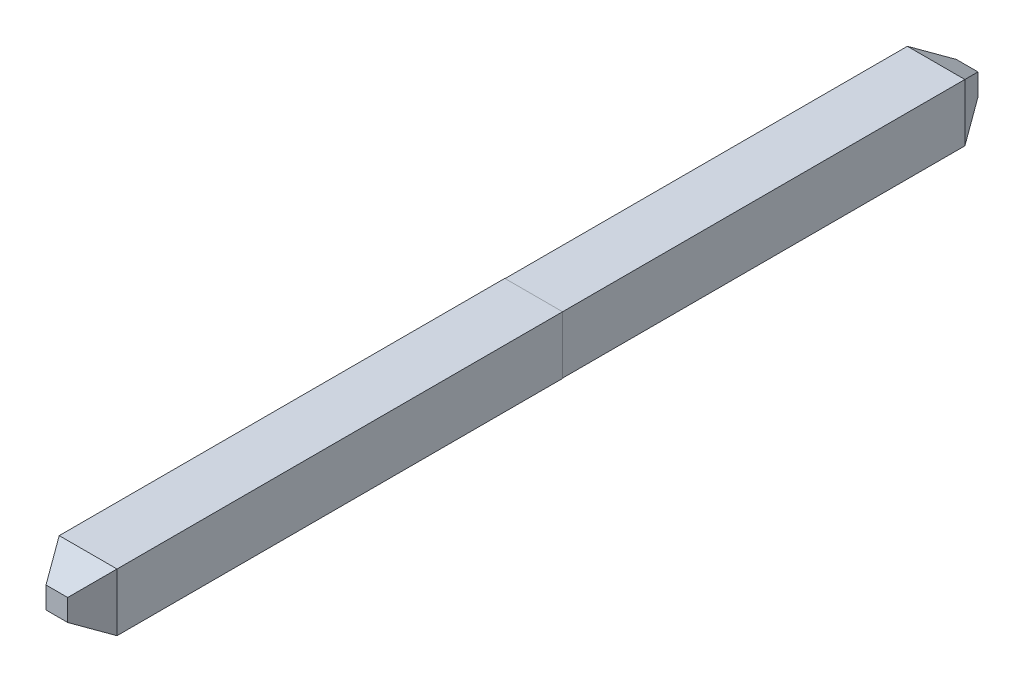
ISO-10303-21;
HEADER;
FILE_DESCRIPTION(('STEP AP214'),'2;1');
FILE_NAME('part.step','',(''),(''),'','','');
FILE_SCHEMA(('AUTOMOTIVE_DESIGN { 1 0 10303 214 1 1 1 1 }'));
ENDSEC;
DATA;
#1=APPLICATION_CONTEXT('core data for automotive mechanical design processes');
#2=APPLICATION_PROTOCOL_DEFINITION('international standard','automotive_design',2000,#1);
#3=PRODUCT_CONTEXT('',#1,'mechanical');
#4=PRODUCT('Part','Part','',(#3));
#5=PRODUCT_RELATED_PRODUCT_CATEGORY('part','',(#4));
#6=PRODUCT_DEFINITION_FORMATION('','',#4);
#7=PRODUCT_DEFINITION_CONTEXT('part definition',#1,'design');
#8=PRODUCT_DEFINITION('design','',#6,#7);
#9=PRODUCT_DEFINITION_SHAPE('','',#8);
#10=(LENGTH_UNIT() NAMED_UNIT(*) SI_UNIT(.MILLI.,.METRE.));
#11=(NAMED_UNIT(*) PLANE_ANGLE_UNIT() SI_UNIT($,.RADIAN.));
#12=(NAMED_UNIT(*) SI_UNIT($,.STERADIAN.) SOLID_ANGLE_UNIT());
#13=UNCERTAINTY_MEASURE_WITH_UNIT(LENGTH_MEASURE(1.E-05),#10,'distance_accuracy_value','');
#14=(GEOMETRIC_REPRESENTATION_CONTEXT(3) GLOBAL_UNCERTAINTY_ASSIGNED_CONTEXT((#13)) GLOBAL_UNIT_ASSIGNED_CONTEXT((#10,
#11,#12)) REPRESENTATION_CONTEXT('',''));
#15=CARTESIAN_POINT('',(0.,0.,0.));
#16=DIRECTION('',(0.,0.,1.));
#17=DIRECTION('',(1.,0.,0.));
#18=AXIS2_PLACEMENT_3D('',#15,#16,#17);
#19=CARTESIAN_POINT('',(-0.2,0.075,-1.64));
#20=DIRECTION('',(0.,-0.866025403784429,0.500000000000017));
#21=DIRECTION('',(0.,-0.500000000000017,-0.866025403784429));
#22=AXIS2_PLACEMENT_3D('',#19,#20,#21);
#23=PLANE('',#22);
#24=DIRECTION('',(-1.,0.,0.));
#25=VECTOR('',#24,1.);
#26=CARTESIAN_POINT('',(0.,0.075,-1.64));
#27=LINE('',#26,#25);
#28=CARTESIAN_POINT('',(-0.075,0.075,-1.64));
#29=VERTEX_POINT('',#28);
#30=CARTESIAN_POINT('',(0.075,0.075,-1.64));
#31=VERTEX_POINT('',#30);
#32=EDGE_CURVE('E20',#29,#31,#27,.F.);
#33=ORIENTED_EDGE('',*,*,#32,.F.);
#34=DIRECTION('',(-0.447213595500116,0.447213595499384,0.774596669241723));
#35=VECTOR('',#34,1.);
#36=CARTESIAN_POINT('',(-0.075,0.075,-1.64));
#37=LINE('',#36,#35);
#38=CARTESIAN_POINT('',(-0.199000000000051,0.199000000000101,-1.42522569986109));
#39=VERTEX_POINT('',#38);
#40=EDGE_CURVE('E134',#29,#39,#37,.T.);
#41=ORIENTED_EDGE('',*,*,#40,.T.);
#42=DIRECTION('',(1.,0.,0.));
#43=VECTOR('',#42,1.);
#44=CARTESIAN_POINT('',(0.199,0.199,-1.425225699861));
#45=LINE('',#44,#43);
#46=CARTESIAN_POINT('',(0.199000000000051,0.199000000000101,-1.42522569986109));
#47=VERTEX_POINT('',#46);
#48=EDGE_CURVE('E161',#39,#47,#45,.T.);
#49=ORIENTED_EDGE('',*,*,#48,.T.);
#50=DIRECTION('',(-0.447213595500116,-0.447213595499384,-0.774596669241723));
#51=VECTOR('',#50,1.);
#52=CARTESIAN_POINT('',(0.199000000000203,0.199,-1.42522569986112));
#53=LINE('',#52,#51);
#54=EDGE_CURVE('E129',#47,#31,#53,.T.);
#55=ORIENTED_EDGE('',*,*,#54,.T.);
#56=EDGE_LOOP('',(#33,#41,#49,#55));
#57=FACE_BOUND('',#56,.T.);
#58=ADVANCED_FACE('F17',(#57),#23,.F.);
#59=CARTESIAN_POINT('',(0.,0.,-1.64));
#60=DIRECTION('',(0.,0.,-1.));
#61=DIRECTION('',(-1.,0.,0.));
#62=AXIS2_PLACEMENT_3D('',#59,#60,#61);
#63=PLANE('',#62);
#64=DIRECTION('',(0.,1.,0.));
#65=VECTOR('',#64,1.);
#66=CARTESIAN_POINT('',(0.075,0.2,-1.64));
#67=LINE('',#66,#65);
#68=CARTESIAN_POINT('',(0.075,-0.075,-1.64));
#69=VERTEX_POINT('',#68);
#70=EDGE_CURVE('E156',#31,#69,#67,.F.);
#71=ORIENTED_EDGE('',*,*,#70,.T.);
#72=DIRECTION('',(1.,0.,0.));
#73=VECTOR('',#72,1.);
#74=CARTESIAN_POINT('',(0.2,-0.075,-1.64));
#75=LINE('',#74,#73);
#76=CARTESIAN_POINT('',(-0.075,-0.075,-1.64));
#77=VERTEX_POINT('',#76);
#78=EDGE_CURVE('E143',#69,#77,#75,.F.);
#79=ORIENTED_EDGE('',*,*,#78,.T.);
#80=DIRECTION('',(0.,1.,0.));
#81=VECTOR('',#80,1.);
#82=CARTESIAN_POINT('',(-0.075,-0.2,-1.64));
#83=LINE('',#82,#81);
#84=EDGE_CURVE('E139',#77,#29,#83,.T.);
#85=ORIENTED_EDGE('',*,*,#84,.T.);
#86=ORIENTED_EDGE('',*,*,#32,.T.);
#87=EDGE_LOOP('',(#71,#79,#85,#86));
#88=FACE_BOUND('',#87,.T.);
#89=ADVANCED_FACE('F141',(#88),#63,.T.);
#90=CARTESIAN_POINT('',(-0.075,-0.2,-1.64));
#91=DIRECTION('',(0.866025403784429,0.,0.500000000000017));
#92=DIRECTION('',(0.500000000000017,0.,-0.866025403784429));
#93=AXIS2_PLACEMENT_3D('',#90,#91,#92);
#94=PLANE('',#93);
#95=ORIENTED_EDGE('',*,*,#84,.F.);
#96=DIRECTION('',(-0.447213595499384,-0.447213595500116,0.774596669241723));
#97=VECTOR('',#96,1.);
#98=CARTESIAN_POINT('',(-0.075,-0.075,-1.64));
#99=LINE('',#98,#97);
#100=CARTESIAN_POINT('',(-0.199000000000101,-0.199000000000051,-1.42522569986109));
#101=VERTEX_POINT('',#100);
#102=EDGE_CURVE('E172',#77,#101,#99,.T.);
#103=ORIENTED_EDGE('',*,*,#102,.T.);
#104=DIRECTION('',(0.,1.,0.));
#105=VECTOR('',#104,1.);
#106=CARTESIAN_POINT('',(-0.199,0.199,-1.425225699861));
#107=LINE('',#106,#105);
#108=EDGE_CURVE('E149',#101,#39,#107,.T.);
#109=ORIENTED_EDGE('',*,*,#108,.T.);
#110=ORIENTED_EDGE('',*,*,#40,.F.);
#111=EDGE_LOOP('',(#95,#103,#109,#110));
#112=FACE_BOUND('',#111,.T.);
#113=ADVANCED_FACE('F147',(#112),#94,.F.);
#114=CARTESIAN_POINT('',(0.075,0.2,-1.64));
#115=DIRECTION('',(-0.866025403784429,0.,0.500000000000017));
#116=DIRECTION('',(0.500000000000017,0.,0.866025403784429));
#117=AXIS2_PLACEMENT_3D('',#114,#115,#116);
#118=PLANE('',#117);
#119=ORIENTED_EDGE('',*,*,#70,.F.);
#120=ORIENTED_EDGE('',*,*,#54,.F.);
#121=DIRECTION('',(0.,1.,0.));
#122=VECTOR('',#121,1.);
#123=CARTESIAN_POINT('',(0.199,-0.199,-1.425225699861));
#124=LINE('',#123,#122);
#125=CARTESIAN_POINT('',(0.199000000000101,-0.199000000000051,-1.42522569986109));
#126=VERTEX_POINT('',#125);
#127=EDGE_CURVE('E184',#47,#126,#124,.F.);
#128=ORIENTED_EDGE('',*,*,#127,.T.);
#129=DIRECTION('',(-0.447213595499384,0.447213595500116,-0.774596669241723));
#130=VECTOR('',#129,1.);
#131=CARTESIAN_POINT('',(0.199,-0.199000000000203,-1.42522569986112));
#132=LINE('',#131,#130);
#133=EDGE_CURVE('E166',#126,#69,#132,.T.);
#134=ORIENTED_EDGE('',*,*,#133,.T.);
#135=EDGE_LOOP('',(#119,#120,#128,#134));
#136=FACE_BOUND('',#135,.T.);
#137=ADVANCED_FACE('F350',(#136),#118,.F.);
#138=CARTESIAN_POINT('',(0.199,0.199,-1.64));
#139=DIRECTION('',(0.,-1.,0.));
#140=DIRECTION('',(0.,0.,-1.));
#141=AXIS2_PLACEMENT_3D('',#138,#139,#140);
#142=PLANE('',#141);
#143=DIRECTION('',(1.,0.,0.));
#144=VECTOR('',#143,1.);
#145=CARTESIAN_POINT('',(0.199,0.199,1.36));
#146=LINE('',#145,#144);
#147=CARTESIAN_POINT('',(0.199,0.199,1.36));
#148=VERTEX_POINT('',#147);
#149=CARTESIAN_POINT('',(-0.199,0.199,1.36));
#150=VERTEX_POINT('',#149);
#151=EDGE_CURVE('E163',#148,#150,#146,.F.);
#152=ORIENTED_EDGE('',*,*,#151,.F.);
#153=DIRECTION('',(0.,0.,1.));
#154=VECTOR('',#153,1.);
#155=CARTESIAN_POINT('',(0.199,0.199,-1.64));
#156=LINE('',#155,#154);
#157=EDGE_CURVE('E190',#148,#47,#156,.F.);
#158=ORIENTED_EDGE('',*,*,#157,.T.);
#159=ORIENTED_EDGE('',*,*,#48,.F.);
#160=DIRECTION('',(0.,0.,-1.));
#161=VECTOR('',#160,1.);
#162=CARTESIAN_POINT('',(-0.199,0.199,-1.64));
#163=LINE('',#162,#161);
#164=EDGE_CURVE('E177',#39,#150,#163,.F.);
#165=ORIENTED_EDGE('',*,*,#164,.T.);
#166=EDGE_LOOP('',(#152,#158,#159,#165));
#167=FACE_BOUND('',#166,.T.);
#168=ADVANCED_FACE('F347',(#167),#142,.F.);
#169=CARTESIAN_POINT('',(0.075,0.2,4.66));
#170=DIRECTION('',(0.866025403784429,0.,0.500000000000017));
#171=DIRECTION('',(0.500000000000017,0.,-0.866025403784429));
#172=AXIS2_PLACEMENT_3D('',#169,#170,#171);
#173=PLANE('',#172);
#174=DIRECTION('',(0.447213595500094,0.447213595499939,-0.774596669241416));
#175=VECTOR('',#174,1.);
#176=CARTESIAN_POINT('',(0.075,0.075,4.66));
#177=LINE('',#176,#175);
#178=CARTESIAN_POINT('',(0.075,0.075,4.66));
#179=VERTEX_POINT('',#178);
#180=CARTESIAN_POINT('',(0.199999999999978,0.199999999999989,4.44349364905398));
#181=VERTEX_POINT('',#180);
#182=EDGE_CURVE('E204',#179,#181,#177,.T.);
#183=ORIENTED_EDGE('',*,*,#182,.F.);
#184=DIRECTION('',(0.,1.,0.));
#185=VECTOR('',#184,1.);
#186=CARTESIAN_POINT('',(0.075,0.,4.66));
#187=LINE('',#186,#185);
#188=CARTESIAN_POINT('',(0.075,-0.075,4.66));
#189=VERTEX_POINT('',#188);
#190=EDGE_CURVE('E200',#179,#189,#187,.F.);
#191=ORIENTED_EDGE('',*,*,#190,.T.);
#192=DIRECTION('',(-0.447213595500094,0.447213595499939,0.774596669241416));
#193=VECTOR('',#192,1.);
#194=CARTESIAN_POINT('',(0.2,-0.199999999999957,4.44349364905398));
#195=LINE('',#194,#193);
#196=CARTESIAN_POINT('',(0.199999999999978,-0.199999999999995,4.44349364905398));
#197=VERTEX_POINT('',#196);
#198=EDGE_CURVE('E194',#197,#189,#195,.T.);
#199=ORIENTED_EDGE('',*,*,#198,.F.);
#200=DIRECTION('',(0.,1.,0.));
#201=VECTOR('',#200,1.);
#202=CARTESIAN_POINT('',(0.2,0.2,4.443493649054));
#203=LINE('',#202,#201);
#204=EDGE_CURVE('E212',#181,#197,#203,.F.);
#205=ORIENTED_EDGE('',*,*,#204,.F.);
#206=EDGE_LOOP('',(#183,#191,#199,#205));
#207=FACE_BOUND('',#206,.T.);
#208=ADVANCED_FACE('F294',(#207),#173,.T.);
#209=CARTESIAN_POINT('',(0.2,-0.075,-1.64));
#210=DIRECTION('',(0.,0.866025403784429,0.500000000000017));
#211=DIRECTION('',(0.,-0.500000000000017,0.866025403784429));
#212=AXIS2_PLACEMENT_3D('',#209,#210,#211);
#213=PLANE('',#212);
#214=ORIENTED_EDGE('',*,*,#78,.F.);
#215=ORIENTED_EDGE('',*,*,#133,.F.);
#216=DIRECTION('',(1.,0.,0.));
#217=VECTOR('',#216,1.);
#218=CARTESIAN_POINT('',(-0.199,-0.199,-1.425225699861));
#219=LINE('',#218,#217);
#220=EDGE_CURVE('E219',#126,#101,#219,.F.);
#221=ORIENTED_EDGE('',*,*,#220,.T.);
#222=ORIENTED_EDGE('',*,*,#102,.F.);
#223=EDGE_LOOP('',(#214,#215,#221,#222));
#224=FACE_BOUND('',#223,.T.);
#225=ADVANCED_FACE('F340',(#224),#213,.F.);
#226=CARTESIAN_POINT('',(-0.199,0.199,-1.64));
#227=DIRECTION('',(1.,0.,0.));
#228=DIRECTION('',(0.,0.,-1.));
#229=AXIS2_PLACEMENT_3D('',#226,#227,#228);
#230=PLANE('',#229);
#231=DIRECTION('',(0.,1.,0.));
#232=VECTOR('',#231,1.);
#233=CARTESIAN_POINT('',(-0.199,0.199,1.36));
#234=LINE('',#233,#232);
#235=CARTESIAN_POINT('',(-0.199,-0.199,1.36));
#236=VERTEX_POINT('',#235);
#237=EDGE_CURVE('E181',#150,#236,#234,.F.);
#238=ORIENTED_EDGE('',*,*,#237,.F.);
#239=ORIENTED_EDGE('',*,*,#164,.F.);
#240=ORIENTED_EDGE('',*,*,#108,.F.);
#241=DIRECTION('',(0.,0.,1.));
#242=VECTOR('',#241,1.);
#243=CARTESIAN_POINT('',(-0.199,-0.199,-1.64));
#244=LINE('',#243,#242);
#245=EDGE_CURVE('E223',#101,#236,#244,.T.);
#246=ORIENTED_EDGE('',*,*,#245,.T.);
#247=EDGE_LOOP('',(#238,#239,#240,#246));
#248=FACE_BOUND('',#247,.T.);
#249=ADVANCED_FACE('F336',(#248),#230,.F.);
#250=CARTESIAN_POINT('',(0.199,-0.199,-1.64));
#251=DIRECTION('',(-1.,0.,0.));
#252=DIRECTION('',(0.,0.,1.));
#253=AXIS2_PLACEMENT_3D('',#250,#251,#252);
#254=PLANE('',#253);
#255=DIRECTION('',(0.,1.,0.));
#256=VECTOR('',#255,1.);
#257=CARTESIAN_POINT('',(0.199,-0.199,1.36));
#258=LINE('',#257,#256);
#259=CARTESIAN_POINT('',(0.199,-0.199,1.36));
#260=VERTEX_POINT('',#259);
#261=EDGE_CURVE('E187',#260,#148,#258,.T.);
#262=ORIENTED_EDGE('',*,*,#261,.F.);
#263=DIRECTION('',(0.,0.,1.));
#264=VECTOR('',#263,1.);
#265=CARTESIAN_POINT('',(0.199,-0.199,-1.64));
#266=LINE('',#265,#264);
#267=EDGE_CURVE('E227',#260,#126,#266,.F.);
#268=ORIENTED_EDGE('',*,*,#267,.T.);
#269=ORIENTED_EDGE('',*,*,#127,.F.);
#270=ORIENTED_EDGE('',*,*,#157,.F.);
#271=EDGE_LOOP('',(#262,#268,#269,#270));
#272=FACE_BOUND('',#271,.T.);
#273=ADVANCED_FACE('F333',(#272),#254,.F.);
#274=CARTESIAN_POINT('',(0.2,-0.075,4.66));
#275=DIRECTION('',(0.,-0.866025403784429,0.500000000000017));
#276=DIRECTION('',(0.,-0.500000000000017,-0.866025403784429));
#277=AXIS2_PLACEMENT_3D('',#274,#275,#276);
#278=PLANE('',#277);
#279=ORIENTED_EDGE('',*,*,#198,.T.);
#280=DIRECTION('',(-1.,0.,0.));
#281=VECTOR('',#280,1.);
#282=CARTESIAN_POINT('',(0.,-0.075,4.66));
#283=LINE('',#282,#281);
#284=CARTESIAN_POINT('',(-0.075,-0.075,4.66));
#285=VERTEX_POINT('',#284);
#286=EDGE_CURVE('E197',#189,#285,#283,.T.);
#287=ORIENTED_EDGE('',*,*,#286,.T.);
#288=DIRECTION('',(0.447213595499939,0.447213595500094,0.774596669241416));
#289=VECTOR('',#288,1.);
#290=CARTESIAN_POINT('',(-0.199999999999957,-0.2,4.44349364905398));
#291=LINE('',#290,#289);
#292=CARTESIAN_POINT('',(-0.199999999999995,-0.199999999999978,4.44349364905398));
#293=VERTEX_POINT('',#292);
#294=EDGE_CURVE('E243',#293,#285,#291,.T.);
#295=ORIENTED_EDGE('',*,*,#294,.F.);
#296=DIRECTION('',(1.,0.,0.));
#297=VECTOR('',#296,1.);
#298=CARTESIAN_POINT('',(0.2,-0.2,4.443493649054));
#299=LINE('',#298,#297);
#300=EDGE_CURVE('E235',#197,#293,#299,.F.);
#301=ORIENTED_EDGE('',*,*,#300,.F.);
#302=EDGE_LOOP('',(#279,#287,#295,#301));
#303=FACE_BOUND('',#302,.T.);
#304=ADVANCED_FACE('F301',(#303),#278,.T.);
#305=CARTESIAN_POINT('',(0.,0.,4.66));
#306=DIRECTION('',(0.,0.,-1.));
#307=DIRECTION('',(-1.,0.,0.));
#308=AXIS2_PLACEMENT_3D('',#305,#306,#307);
#309=PLANE('',#308);
#310=DIRECTION('',(1.,0.,0.));
#311=VECTOR('',#310,1.);
#312=CARTESIAN_POINT('',(-0.2,0.075,4.66));
#313=LINE('',#312,#311);
#314=CARTESIAN_POINT('',(-0.075,0.075,4.66));
#315=VERTEX_POINT('',#314);
#316=EDGE_CURVE('E208',#315,#179,#313,.T.);
#317=ORIENTED_EDGE('',*,*,#316,.F.);
#318=DIRECTION('',(0.,1.,0.));
#319=VECTOR('',#318,1.);
#320=CARTESIAN_POINT('',(-0.075,-0.2,4.66));
#321=LINE('',#320,#319);
#322=EDGE_CURVE('E247',#285,#315,#321,.T.);
#323=ORIENTED_EDGE('',*,*,#322,.F.);
#324=ORIENTED_EDGE('',*,*,#286,.F.);
#325=ORIENTED_EDGE('',*,*,#190,.F.);
#326=EDGE_LOOP('',(#317,#323,#324,#325));
#327=FACE_BOUND('',#326,.T.);
#328=ADVANCED_FACE('F291',(#327),#309,.F.);
#329=CARTESIAN_POINT('',(-0.2,0.075,4.66));
#330=DIRECTION('',(0.,0.866025403784429,0.500000000000017));
#331=DIRECTION('',(0.,-0.500000000000017,0.866025403784429));
#332=AXIS2_PLACEMENT_3D('',#329,#330,#331);
#333=PLANE('',#332);
#334=DIRECTION('',(-0.447213595499939,0.447213595500094,-0.774596669241416));
#335=VECTOR('',#334,1.);
#336=CARTESIAN_POINT('',(-0.075,0.075,4.66));
#337=LINE('',#336,#335);
#338=CARTESIAN_POINT('',(-0.199999999999989,0.199999999999978,4.44349364905398));
#339=VERTEX_POINT('',#338);
#340=EDGE_CURVE('E239',#315,#339,#337,.T.);
#341=ORIENTED_EDGE('',*,*,#340,.F.);
#342=ORIENTED_EDGE('',*,*,#316,.T.);
#343=ORIENTED_EDGE('',*,*,#182,.T.);
#344=DIRECTION('',(1.,0.,0.));
#345=VECTOR('',#344,1.);
#346=CARTESIAN_POINT('',(-0.2,0.2,4.443493649054));
#347=LINE('',#346,#345);
#348=EDGE_CURVE('E251',#339,#181,#347,.T.);
#349=ORIENTED_EDGE('',*,*,#348,.F.);
#350=EDGE_LOOP('',(#341,#342,#343,#349));
#351=FACE_BOUND('',#350,.T.);
#352=ADVANCED_FACE('F285',(#351),#333,.T.);
#353=CARTESIAN_POINT('',(0.2,0.2,4.66));
#354=DIRECTION('',(1.,0.,0.));
#355=DIRECTION('',(0.,0.,-1.));
#356=AXIS2_PLACEMENT_3D('',#353,#354,#355);
#357=PLANE('',#356);
#358=DIRECTION('',(0.,0.,-1.));
#359=VECTOR('',#358,1.);
#360=CARTESIAN_POINT('',(0.2,-0.2,4.66));
#361=LINE('',#360,#359);
#362=CARTESIAN_POINT('',(0.2,-0.2,1.36));
#363=VERTEX_POINT('',#362);
#364=EDGE_CURVE('E231',#363,#197,#361,.F.);
#365=ORIENTED_EDGE('',*,*,#364,.F.);
#366=DIRECTION('',(0.,1.,0.));
#367=VECTOR('',#366,1.);
#368=CARTESIAN_POINT('',(0.2,0.2,1.36));
#369=LINE('',#368,#367);
#370=CARTESIAN_POINT('',(0.2,0.2,1.36));
#371=VERTEX_POINT('',#370);
#372=EDGE_CURVE('E216',#363,#371,#369,.T.);
#373=ORIENTED_EDGE('',*,*,#372,.T.);
#374=DIRECTION('',(0.,0.,1.));
#375=VECTOR('',#374,1.);
#376=CARTESIAN_POINT('',(0.2,0.2,4.66));
#377=LINE('',#376,#375);
#378=EDGE_CURVE('E255',#181,#371,#377,.F.);
#379=ORIENTED_EDGE('',*,*,#378,.F.);
#380=ORIENTED_EDGE('',*,*,#204,.T.);
#381=EDGE_LOOP('',(#365,#373,#379,#380));
#382=FACE_BOUND('',#381,.T.);
#383=ADVANCED_FACE('F298',(#382),#357,.T.);
#384=CARTESIAN_POINT('',(-0.199,-0.199,-1.64));
#385=DIRECTION('',(0.,1.,0.));
#386=DIRECTION('',(0.,0.,1.));
#387=AXIS2_PLACEMENT_3D('',#384,#385,#386);
#388=PLANE('',#387);
#389=DIRECTION('',(-1.,0.,0.));
#390=VECTOR('',#389,1.);
#391=CARTESIAN_POINT('',(0.,-0.199,1.36));
#392=LINE('',#391,#390);
#393=EDGE_CURVE('E264',#236,#260,#392,.F.);
#394=ORIENTED_EDGE('',*,*,#393,.F.);
#395=ORIENTED_EDGE('',*,*,#245,.F.);
#396=ORIENTED_EDGE('',*,*,#220,.F.);
#397=ORIENTED_EDGE('',*,*,#267,.F.);
#398=EDGE_LOOP('',(#394,#395,#396,#397));
#399=FACE_BOUND('',#398,.T.);
#400=ADVANCED_FACE('F321',(#399),#388,.F.);
#401=CARTESIAN_POINT('',(0.2,-0.2,4.66));
#402=DIRECTION('',(0.,-1.,0.));
#403=DIRECTION('',(0.,0.,-1.));
#404=AXIS2_PLACEMENT_3D('',#401,#402,#403);
#405=PLANE('',#404);
#406=DIRECTION('',(0.,0.,1.));
#407=VECTOR('',#406,1.);
#408=CARTESIAN_POINT('',(-0.2,-0.2,4.66));
#409=LINE('',#408,#407);
#410=CARTESIAN_POINT('',(-0.2,-0.2,1.36));
#411=VERTEX_POINT('',#410);
#412=EDGE_CURVE('E268',#411,#293,#409,.T.);
#413=ORIENTED_EDGE('',*,*,#412,.F.);
#414=DIRECTION('',(-1.,0.,0.));
#415=VECTOR('',#414,1.);
#416=CARTESIAN_POINT('',(0.,-0.2,1.36));
#417=LINE('',#416,#415);
#418=EDGE_CURVE('E260',#363,#411,#417,.T.);
#419=ORIENTED_EDGE('',*,*,#418,.F.);
#420=ORIENTED_EDGE('',*,*,#364,.T.);
#421=ORIENTED_EDGE('',*,*,#300,.T.);
#422=EDGE_LOOP('',(#413,#419,#420,#421));
#423=FACE_BOUND('',#422,.T.);
#424=ADVANCED_FACE('F303',(#423),#405,.T.);
#425=CARTESIAN_POINT('',(-0.075,-0.2,4.66));
#426=DIRECTION('',(-0.866025403784429,0.,0.500000000000017));
#427=DIRECTION('',(0.500000000000017,0.,0.866025403784429));
#428=AXIS2_PLACEMENT_3D('',#425,#426,#427);
#429=PLANE('',#428);
#430=ORIENTED_EDGE('',*,*,#294,.T.);
#431=ORIENTED_EDGE('',*,*,#322,.T.);
#432=ORIENTED_EDGE('',*,*,#340,.T.);
#433=DIRECTION('',(0.,1.,0.));
#434=VECTOR('',#433,1.);
#435=CARTESIAN_POINT('',(-0.2,-0.2,4.443493649054));
#436=LINE('',#435,#434);
#437=EDGE_CURVE('E272',#293,#339,#436,.T.);
#438=ORIENTED_EDGE('',*,*,#437,.F.);
#439=EDGE_LOOP('',(#430,#431,#432,#438));
#440=FACE_BOUND('',#439,.T.);
#441=ADVANCED_FACE('F287',(#440),#429,.T.);
#442=CARTESIAN_POINT('',(-0.2,0.2,4.66));
#443=DIRECTION('',(0.,1.,0.));
#444=DIRECTION('',(0.,0.,1.));
#445=AXIS2_PLACEMENT_3D('',#442,#443,#444);
#446=PLANE('',#445);
#447=ORIENTED_EDGE('',*,*,#378,.T.);
#448=DIRECTION('',(-1.,0.,0.));
#449=VECTOR('',#448,1.);
#450=CARTESIAN_POINT('',(0.,0.2,1.36));
#451=LINE('',#450,#449);
#452=CARTESIAN_POINT('',(-0.2,0.2,1.36));
#453=VERTEX_POINT('',#452);
#454=EDGE_CURVE('E40',#453,#371,#451,.F.);
#455=ORIENTED_EDGE('',*,*,#454,.F.);
#456=DIRECTION('',(0.,0.,1.));
#457=VECTOR('',#456,1.);
#458=CARTESIAN_POINT('',(-0.2,0.2,4.66));
#459=LINE('',#458,#457);
#460=EDGE_CURVE('E27',#339,#453,#459,.F.);
#461=ORIENTED_EDGE('',*,*,#460,.F.);
#462=ORIENTED_EDGE('',*,*,#348,.T.);
#463=EDGE_LOOP('',(#447,#455,#461,#462));
#464=FACE_BOUND('',#463,.T.);
#465=ADVANCED_FACE('F281',(#464),#446,.T.);
#466=CARTESIAN_POINT('',(0.,0.,1.36));
#467=DIRECTION('',(0.,0.,-1.));
#468=DIRECTION('',(-1.,0.,0.));
#469=AXIS2_PLACEMENT_3D('',#466,#467,#468);
#470=PLANE('',#469);
#471=ORIENTED_EDGE('',*,*,#237,.T.);
#472=ORIENTED_EDGE('',*,*,#393,.T.);
#473=ORIENTED_EDGE('',*,*,#261,.T.);
#474=ORIENTED_EDGE('',*,*,#151,.T.);
#475=EDGE_LOOP('',(#471,#472,#473,#474));
#476=FACE_BOUND('',#475,.T.);
#477=ORIENTED_EDGE('',*,*,#372,.F.);
#478=ORIENTED_EDGE('',*,*,#418,.T.);
#479=DIRECTION('',(0.,1.,0.));
#480=VECTOR('',#479,1.);
#481=CARTESIAN_POINT('',(-0.2,-0.2,1.36));
#482=LINE('',#481,#480);
#483=EDGE_CURVE('E11',#453,#411,#482,.F.);
#484=ORIENTED_EDGE('',*,*,#483,.F.);
#485=ORIENTED_EDGE('',*,*,#454,.T.);
#486=EDGE_LOOP('',(#477,#478,#484,#485));
#487=FACE_BOUND('',#486,.T.);
#488=ADVANCED_FACE('F305',(#476,#487),#470,.T.);
#489=CARTESIAN_POINT('',(-0.2,-0.2,4.66));
#490=DIRECTION('',(-1.,0.,0.));
#491=DIRECTION('',(0.,0.,1.));
#492=AXIS2_PLACEMENT_3D('',#489,#490,#491);
#493=PLANE('',#492);
#494=ORIENTED_EDGE('',*,*,#460,.T.);
#495=ORIENTED_EDGE('',*,*,#483,.T.);
#496=ORIENTED_EDGE('',*,*,#412,.T.);
#497=ORIENTED_EDGE('',*,*,#437,.T.);
#498=EDGE_LOOP('',(#494,#495,#496,#497));
#499=FACE_BOUND('',#498,.T.);
#500=ADVANCED_FACE('F279',(#499),#493,.T.);
#501=CLOSED_SHELL('',(#58,#89,#113,#137,#168,#208,#225,#249,#273,#304,#328,#352,#383,#400,#424,
#441,#465,#488,#500));
#502=MANIFOLD_SOLID_BREP('B1',#501);
#503=ADVANCED_BREP_SHAPE_REPRESENTATION('',(#18,#502),#14);
#504=SHAPE_DEFINITION_REPRESENTATION(#9,#503);
ENDSEC;
END-ISO-10303-21;
